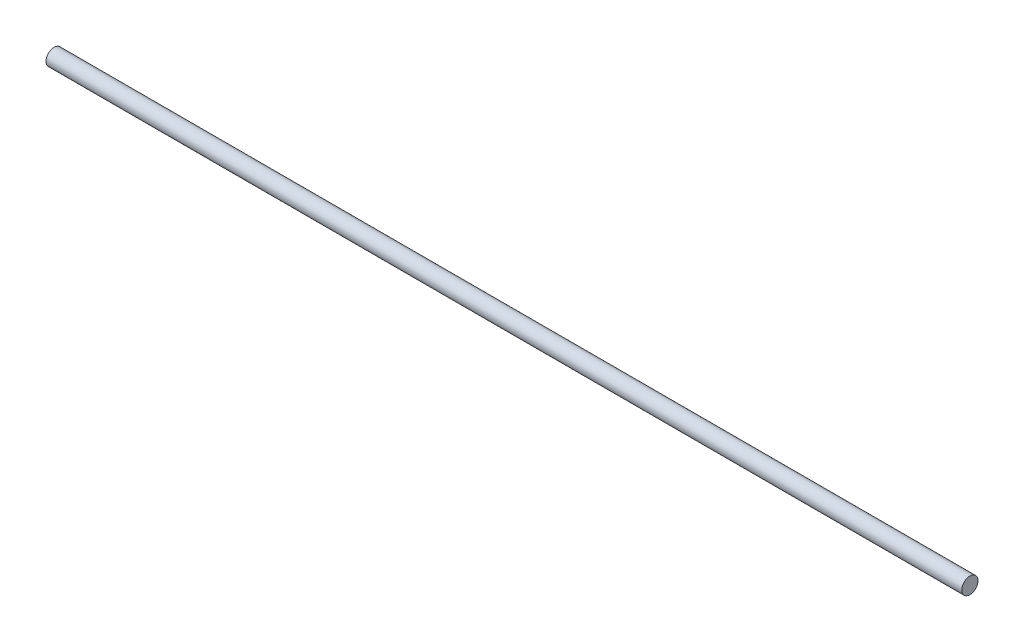
ISO-10303-21;
HEADER;
FILE_DESCRIPTION(('STEP AP214'),'2;1');
FILE_NAME('part.step','',(''),(''),'','','');
FILE_SCHEMA(('AUTOMOTIVE_DESIGN { 1 0 10303 214 1 1 1 1 }'));
ENDSEC;
DATA;
#1=APPLICATION_CONTEXT('core data for automotive mechanical design processes');
#2=APPLICATION_PROTOCOL_DEFINITION('international standard','automotive_design',2000,#1);
#3=PRODUCT_CONTEXT('',#1,'mechanical');
#4=PRODUCT('Part','Part','',(#3));
#5=PRODUCT_RELATED_PRODUCT_CATEGORY('part','',(#4));
#6=PRODUCT_DEFINITION_FORMATION('','',#4);
#7=PRODUCT_DEFINITION_CONTEXT('part definition',#1,'design');
#8=PRODUCT_DEFINITION('design','',#6,#7);
#9=PRODUCT_DEFINITION_SHAPE('','',#8);
#10=(LENGTH_UNIT() NAMED_UNIT(*) SI_UNIT(.MILLI.,.METRE.));
#11=(NAMED_UNIT(*) PLANE_ANGLE_UNIT() SI_UNIT($,.RADIAN.));
#12=(NAMED_UNIT(*) SI_UNIT($,.STERADIAN.) SOLID_ANGLE_UNIT());
#13=UNCERTAINTY_MEASURE_WITH_UNIT(LENGTH_MEASURE(1.E-05),#10,'distance_accuracy_value','');
#14=(GEOMETRIC_REPRESENTATION_CONTEXT(3) GLOBAL_UNCERTAINTY_ASSIGNED_CONTEXT((#13)) GLOBAL_UNIT_ASSIGNED_CONTEXT((#10,
#11,#12)) REPRESENTATION_CONTEXT('',''));
#15=CARTESIAN_POINT('',(0.,0.,0.));
#16=DIRECTION('',(0.,0.,1.));
#17=DIRECTION('',(1.,0.,0.));
#18=AXIS2_PLACEMENT_3D('',#15,#16,#17);
#19=CARTESIAN_POINT('',(282.,0.,0.));
#20=DIRECTION('',(-1.,0.,0.));
#21=DIRECTION('',(0.,0.,1.));
#22=AXIS2_PLACEMENT_3D('',#19,#20,#21);
#23=CYLINDRICAL_SURFACE('',#22,2.5);
#24=CARTESIAN_POINT('',(282.,0.,0.));
#25=DIRECTION('',(1.,0.,0.));
#26=DIRECTION('',(0.,0.,-1.));
#27=AXIS2_PLACEMENT_3D('',#24,#25,#26);
#28=CIRCLE('',#27,2.5);
#29=CARTESIAN_POINT('',(282.,0.,-2.5));
#30=VERTEX_POINT('',#29);
#31=EDGE_CURVE('E10',#30,#30,#28,.T.);
#32=ORIENTED_EDGE('',*,*,#31,.F.);
#33=EDGE_LOOP('',(#32));
#34=FACE_BOUND('',#33,.T.);
#35=CARTESIAN_POINT('',(0.,0.,0.));
#36=DIRECTION('',(1.,0.,0.));
#37=DIRECTION('',(0.,0.,-1.));
#38=AXIS2_PLACEMENT_3D('',#35,#36,#37);
#39=CIRCLE('',#38,2.5);
#40=CARTESIAN_POINT('',(0.,0.,-2.5));
#41=VERTEX_POINT('',#40);
#42=EDGE_CURVE('E46',#41,#41,#39,.T.);
#43=ORIENTED_EDGE('',*,*,#42,.T.);
#44=EDGE_LOOP('',(#43));
#45=FACE_BOUND('',#44,.T.);
#46=ADVANCED_FACE('F43',(#34,#45),#23,.T.);
#47=CARTESIAN_POINT('',(282.,0.,0.));
#48=DIRECTION('',(1.,0.,0.));
#49=DIRECTION('',(0.,0.,-1.));
#50=AXIS2_PLACEMENT_3D('',#47,#48,#49);
#51=PLANE('',#50);
#52=ORIENTED_EDGE('',*,*,#31,.T.);
#53=EDGE_LOOP('',(#52));
#54=FACE_BOUND('',#53,.T.);
#55=ADVANCED_FACE('F60',(#54),#51,.T.);
#56=CARTESIAN_POINT('',(0.,0.,0.));
#57=DIRECTION('',(1.,0.,0.));
#58=DIRECTION('',(0.,0.,-1.));
#59=AXIS2_PLACEMENT_3D('',#56,#57,#58);
#60=PLANE('',#59);
#61=ORIENTED_EDGE('',*,*,#42,.F.);
#62=EDGE_LOOP('',(#61));
#63=FACE_BOUND('',#62,.T.);
#64=ADVANCED_FACE('F58',(#63),#60,.F.);
#65=CLOSED_SHELL('',(#46,#55,#64));
#66=MANIFOLD_SOLID_BREP('B2',#65);
#67=ADVANCED_BREP_SHAPE_REPRESENTATION('',(#18,#66),#14);
#68=SHAPE_DEFINITION_REPRESENTATION(#9,#67);
ENDSEC;
END-ISO-10303-21;
